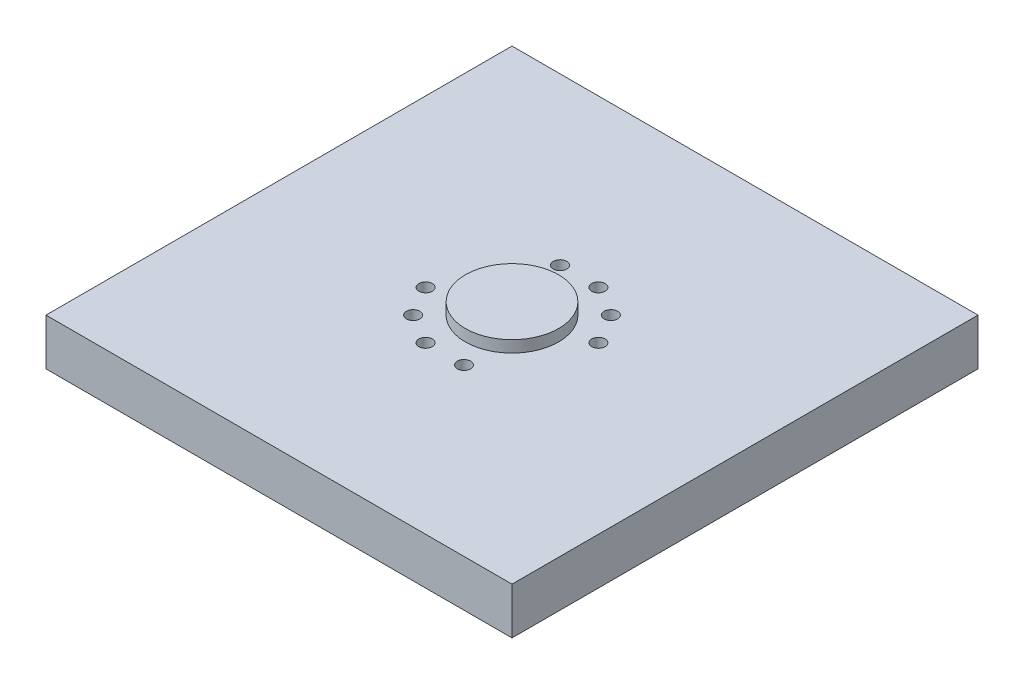
ISO-10303-21;
HEADER;
FILE_DESCRIPTION(('STEP AP214'),'2;1');
FILE_NAME('part.step','',(''),(''),'','','');
FILE_SCHEMA(('AUTOMOTIVE_DESIGN { 1 0 10303 214 1 1 1 1 }'));
ENDSEC;
DATA;
#1=APPLICATION_CONTEXT('core data for automotive mechanical design processes');
#2=APPLICATION_PROTOCOL_DEFINITION('international standard','automotive_design',2000,#1);
#3=PRODUCT_CONTEXT('',#1,'mechanical');
#4=PRODUCT('Part','Part','',(#3));
#5=PRODUCT_RELATED_PRODUCT_CATEGORY('part','',(#4));
#6=PRODUCT_DEFINITION_FORMATION('','',#4);
#7=PRODUCT_DEFINITION_CONTEXT('part definition',#1,'design');
#8=PRODUCT_DEFINITION('design','',#6,#7);
#9=PRODUCT_DEFINITION_SHAPE('','',#8);
#10=(LENGTH_UNIT() NAMED_UNIT(*) SI_UNIT(.MILLI.,.METRE.));
#11=(NAMED_UNIT(*) PLANE_ANGLE_UNIT() SI_UNIT($,.RADIAN.));
#12=(NAMED_UNIT(*) SI_UNIT($,.STERADIAN.) SOLID_ANGLE_UNIT());
#13=UNCERTAINTY_MEASURE_WITH_UNIT(LENGTH_MEASURE(1.E-05),#10,'distance_accuracy_value','');
#14=(GEOMETRIC_REPRESENTATION_CONTEXT(3) GLOBAL_UNCERTAINTY_ASSIGNED_CONTEXT((#13)) GLOBAL_UNIT_ASSIGNED_CONTEXT((#10,
#11,#12)) REPRESENTATION_CONTEXT('',''));
#15=CARTESIAN_POINT('',(0.,0.,0.));
#16=DIRECTION('',(0.,0.,1.));
#17=DIRECTION('',(1.,0.,0.));
#18=AXIS2_PLACEMENT_3D('',#15,#16,#17);
#19=CARTESIAN_POINT('',(0.,15.875,0.));
#20=DIRECTION('',(1.,0.,0.));
#21=DIRECTION('',(0.,0.,-1.));
#22=AXIS2_PLACEMENT_3D('',#19,#20,#21);
#23=PLANE('',#22);
#24=DIRECTION('',(0.,0.,1.));
#25=VECTOR('',#24,1.);
#26=CARTESIAN_POINT('',(0.,12.7,-127.));
#27=LINE('',#26,#25);
#28=CARTESIAN_POINT('',(0.,12.7,-127.));
#29=VERTEX_POINT('',#28);
#30=CARTESIAN_POINT('',(0.,12.7,0.));
#31=VERTEX_POINT('',#30);
#32=EDGE_CURVE('E73',#29,#31,#27,.T.);
#33=ORIENTED_EDGE('',*,*,#32,.F.);
#34=DIRECTION('',(0.,-1.,0.));
#35=VECTOR('',#34,1.);
#36=CARTESIAN_POINT('',(0.,15.875,-127.));
#37=LINE('',#36,#35);
#38=CARTESIAN_POINT('',(0.,0.,-127.));
#39=VERTEX_POINT('',#38);
#40=EDGE_CURVE('E55',#29,#39,#37,.T.);
#41=ORIENTED_EDGE('',*,*,#40,.T.);
#42=DIRECTION('',(0.,0.,1.));
#43=VECTOR('',#42,1.);
#44=CARTESIAN_POINT('',(0.,0.,0.));
#45=LINE('',#44,#43);
#46=CARTESIAN_POINT('',(0.,0.,0.));
#47=VERTEX_POINT('',#46);
#48=EDGE_CURVE('E103',#39,#47,#45,.T.);
#49=ORIENTED_EDGE('',*,*,#48,.T.);
#50=DIRECTION('',(0.,-1.,0.));
#51=VECTOR('',#50,1.);
#52=CARTESIAN_POINT('',(0.,15.875,0.));
#53=LINE('',#52,#51);
#54=EDGE_CURVE('E11',#31,#47,#53,.T.);
#55=ORIENTED_EDGE('',*,*,#54,.F.);
#56=EDGE_LOOP('',(#33,#41,#49,#55));
#57=FACE_BOUND('',#56,.T.);
#58=ADVANCED_FACE('F33',(#57),#23,.F.);
#59=CARTESIAN_POINT('',(0.,15.875,0.));
#60=DIRECTION('',(0.,0.,-1.));
#61=DIRECTION('',(-1.,0.,0.));
#62=AXIS2_PLACEMENT_3D('',#59,#60,#61);
#63=PLANE('',#62);
#64=DIRECTION('',(1.,0.,0.));
#65=VECTOR('',#64,1.);
#66=CARTESIAN_POINT('',(0.,12.7,0.));
#67=LINE('',#66,#65);
#68=CARTESIAN_POINT('',(127.,12.7,0.));
#69=VERTEX_POINT('',#68);
#70=EDGE_CURVE('E80',#31,#69,#67,.T.);
#71=ORIENTED_EDGE('',*,*,#70,.F.);
#72=ORIENTED_EDGE('',*,*,#54,.T.);
#73=DIRECTION('',(1.,0.,0.));
#74=VECTOR('',#73,1.);
#75=CARTESIAN_POINT('',(0.,0.,0.));
#76=LINE('',#75,#74);
#77=CARTESIAN_POINT('',(127.,0.,0.));
#78=VERTEX_POINT('',#77);
#79=EDGE_CURVE('E100',#47,#78,#76,.T.);
#80=ORIENTED_EDGE('',*,*,#79,.T.);
#81=DIRECTION('',(0.,-1.,0.));
#82=VECTOR('',#81,1.);
#83=CARTESIAN_POINT('',(127.,15.875,0.));
#84=LINE('',#83,#82);
#85=EDGE_CURVE('E40',#69,#78,#84,.T.);
#86=ORIENTED_EDGE('',*,*,#85,.F.);
#87=EDGE_LOOP('',(#71,#72,#80,#86));
#88=FACE_BOUND('',#87,.T.);
#89=ADVANCED_FACE('F101',(#88),#63,.F.);
#90=CARTESIAN_POINT('',(127.,15.875,0.));
#91=DIRECTION('',(-1.,0.,0.));
#92=DIRECTION('',(0.,0.,1.));
#93=AXIS2_PLACEMENT_3D('',#90,#91,#92);
#94=PLANE('',#93);
#95=DIRECTION('',(0.,0.,-1.));
#96=VECTOR('',#95,1.);
#97=CARTESIAN_POINT('',(127.,12.7,0.));
#98=LINE('',#97,#96);
#99=CARTESIAN_POINT('',(127.,12.7,-127.));
#100=VERTEX_POINT('',#99);
#101=EDGE_CURVE('E47',#69,#100,#98,.T.);
#102=ORIENTED_EDGE('',*,*,#101,.F.);
#103=ORIENTED_EDGE('',*,*,#85,.T.);
#104=DIRECTION('',(0.,0.,-1.));
#105=VECTOR('',#104,1.);
#106=CARTESIAN_POINT('',(127.,0.,0.));
#107=LINE('',#106,#105);
#108=CARTESIAN_POINT('',(127.,0.,-127.));
#109=VERTEX_POINT('',#108);
#110=EDGE_CURVE('E89',#78,#109,#107,.T.);
#111=ORIENTED_EDGE('',*,*,#110,.T.);
#112=DIRECTION('',(0.,-1.,0.));
#113=VECTOR('',#112,1.);
#114=CARTESIAN_POINT('',(127.,15.875,-127.));
#115=LINE('',#114,#113);
#116=EDGE_CURVE('E86',#100,#109,#115,.T.);
#117=ORIENTED_EDGE('',*,*,#116,.F.);
#118=EDGE_LOOP('',(#102,#103,#111,#117));
#119=FACE_BOUND('',#118,.T.);
#120=ADVANCED_FACE('F96',(#119),#94,.F.);
#121=CARTESIAN_POINT('',(0.,15.875,-127.));
#122=DIRECTION('',(0.,0.,1.));
#123=DIRECTION('',(1.,0.,0.));
#124=AXIS2_PLACEMENT_3D('',#121,#122,#123);
#125=PLANE('',#124);
#126=DIRECTION('',(-1.,0.,0.));
#127=VECTOR('',#126,1.);
#128=CARTESIAN_POINT('',(127.,12.7,-127.));
#129=LINE('',#128,#127);
#130=EDGE_CURVE('E71',#100,#29,#129,.T.);
#131=ORIENTED_EDGE('',*,*,#130,.F.);
#132=ORIENTED_EDGE('',*,*,#116,.T.);
#133=DIRECTION('',(-1.,0.,0.));
#134=VECTOR('',#133,1.);
#135=CARTESIAN_POINT('',(0.,0.,-127.));
#136=LINE('',#135,#134);
#137=EDGE_CURVE('E84',#109,#39,#136,.T.);
#138=ORIENTED_EDGE('',*,*,#137,.T.);
#139=ORIENTED_EDGE('',*,*,#40,.F.);
#140=EDGE_LOOP('',(#131,#132,#138,#139));
#141=FACE_BOUND('',#140,.T.);
#142=ADVANCED_FACE('F82',(#141),#125,.F.);
#143=CARTESIAN_POINT('',(0.,0.,0.));
#144=DIRECTION('',(0.,-1.,0.));
#145=DIRECTION('',(0.,0.,-1.));
#146=AXIS2_PLACEMENT_3D('',#143,#144,#145);
#147=PLANE('',#146);
#148=CARTESIAN_POINT('',(50.0296158183963,0.,-50.0296158183963));
#149=DIRECTION('',(0.,-1.,0.));
#150=DIRECTION('',(0.,0.,-1.));
#151=AXIS2_PLACEMENT_3D('',#148,#149,#150);
#152=CIRCLE('',#151,1.8288);
#153=CARTESIAN_POINT('',(50.0296158183963,0.,-51.8584158183963));
#154=VERTEX_POINT('',#153);
#155=EDGE_CURVE('E155',#154,#154,#152,.F.);
#156=ORIENTED_EDGE('',*,*,#155,.T.);
#157=EDGE_LOOP('',(#156));
#158=FACE_BOUND('',#157,.T.);
#159=CARTESIAN_POINT('',(76.9703841816037,0.,-76.9703841816037));
#160=DIRECTION('',(0.,-1.,0.));
#161=DIRECTION('',(0.,0.,-1.));
#162=AXIS2_PLACEMENT_3D('',#159,#160,#161);
#163=CIRCLE('',#162,1.8288);
#164=CARTESIAN_POINT('',(76.9703841816037,0.,-78.7991841816037));
#165=VERTEX_POINT('',#164);
#166=EDGE_CURVE('E152',#165,#165,#163,.F.);
#167=ORIENTED_EDGE('',*,*,#166,.T.);
#168=EDGE_LOOP('',(#167));
#169=FACE_BOUND('',#168,.T.);
#170=CARTESIAN_POINT('',(68.7334374864451,0.,-81.8170312025577));
#171=DIRECTION('',(0.,-1.,0.));
#172=DIRECTION('',(0.,0.,-1.));
#173=AXIS2_PLACEMENT_3D('',#170,#171,#172);
#174=CIRCLE('',#173,1.82880000000001);
#175=CARTESIAN_POINT('',(68.7334374864451,0.,-83.6458312025577));
#176=VERTEX_POINT('',#175);
#177=EDGE_CURVE('E143',#176,#176,#174,.F.);
#178=ORIENTED_EDGE('',*,*,#177,.T.);
#179=EDGE_LOOP('',(#178));
#180=FACE_BOUND('',#179,.T.);
#181=CARTESIAN_POINT('',(58.2665625135549,0.,-45.1829687974423));
#182=DIRECTION('',(0.,-1.,0.));
#183=DIRECTION('',(0.,0.,-1.));
#184=AXIS2_PLACEMENT_3D('',#181,#182,#183);
#185=CIRCLE('',#184,1.82880000000001);
#186=CARTESIAN_POINT('',(58.2665625135549,0.,-47.0117687974423));
#187=VERTEX_POINT('',#186);
#188=EDGE_CURVE('E140',#187,#187,#185,.F.);
#189=ORIENTED_EDGE('',*,*,#188,.T.);
#190=EDGE_LOOP('',(#189));
#191=FACE_BOUND('',#190,.T.);
#192=CARTESIAN_POINT('',(58.2665625135549,0.,-81.8170312025577));
#193=DIRECTION('',(0.,-1.,0.));
#194=DIRECTION('',(0.,0.,-1.));
#195=AXIS2_PLACEMENT_3D('',#192,#193,#194);
#196=CIRCLE('',#195,1.8288);
#197=CARTESIAN_POINT('',(58.2665625135549,0.,-83.6458312025577));
#198=VERTEX_POINT('',#197);
#199=EDGE_CURVE('E134',#198,#198,#196,.F.);
#200=ORIENTED_EDGE('',*,*,#199,.T.);
#201=EDGE_LOOP('',(#200));
#202=FACE_BOUND('',#201,.T.);
#203=CARTESIAN_POINT('',(81.8170312025577,0.,-68.7334374864451));
#204=DIRECTION('',(0.,-1.,0.));
#205=DIRECTION('',(0.,0.,-1.));
#206=AXIS2_PLACEMENT_3D('',#203,#204,#205);
#207=CIRCLE('',#206,1.82880000000001);
#208=CARTESIAN_POINT('',(81.8170312025577,0.,-70.5622374864451));
#209=VERTEX_POINT('',#208);
#210=EDGE_CURVE('E128',#209,#209,#207,.F.);
#211=ORIENTED_EDGE('',*,*,#210,.T.);
#212=EDGE_LOOP('',(#211));
#213=FACE_BOUND('',#212,.T.);
#214=CARTESIAN_POINT('',(68.7334374864451,0.,-45.1829687974423));
#215=DIRECTION('',(0.,-1.,0.));
#216=DIRECTION('',(0.,0.,-1.));
#217=AXIS2_PLACEMENT_3D('',#214,#215,#216);
#218=CIRCLE('',#217,1.8288);
#219=CARTESIAN_POINT('',(68.7334374864451,0.,-47.0117687974423));
#220=VERTEX_POINT('',#219);
#221=EDGE_CURVE('E122',#220,#220,#218,.F.);
#222=ORIENTED_EDGE('',*,*,#221,.T.);
#223=EDGE_LOOP('',(#222));
#224=FACE_BOUND('',#223,.T.);
#225=CARTESIAN_POINT('',(45.1829687974423,0.,-58.2665625135549));
#226=DIRECTION('',(0.,-1.,0.));
#227=DIRECTION('',(0.,0.,-1.));
#228=AXIS2_PLACEMENT_3D('',#225,#226,#227);
#229=CIRCLE('',#228,1.8288);
#230=CARTESIAN_POINT('',(45.1829687974423,0.,-60.0953625135549));
#231=VERTEX_POINT('',#230);
#232=EDGE_CURVE('E116',#231,#231,#229,.F.);
#233=ORIENTED_EDGE('',*,*,#232,.T.);
#234=EDGE_LOOP('',(#233));
#235=FACE_BOUND('',#234,.T.);
#236=ORIENTED_EDGE('',*,*,#48,.F.);
#237=ORIENTED_EDGE('',*,*,#137,.F.);
#238=ORIENTED_EDGE('',*,*,#110,.F.);
#239=ORIENTED_EDGE('',*,*,#79,.F.);
#240=EDGE_LOOP('',(#236,#237,#238,#239));
#241=FACE_BOUND('',#240,.T.);
#242=ADVANCED_FACE('F105',(#158,#169,#180,#191,#202,#213,#224,#235,#241),#147,.T.);
#243=CARTESIAN_POINT('',(0.,12.7,0.));
#244=DIRECTION('',(0.,1.,0.));
#245=DIRECTION('',(0.,0.,1.));
#246=AXIS2_PLACEMENT_3D('',#243,#244,#245);
#247=PLANE('',#246);
#248=CARTESIAN_POINT('',(50.0296158183963,12.7,-50.0296158183963));
#249=DIRECTION('',(0.,1.,0.));
#250=DIRECTION('',(0.,0.,1.));
#251=AXIS2_PLACEMENT_3D('',#248,#249,#250);
#252=CIRCLE('',#251,1.8288);
#253=CARTESIAN_POINT('',(50.0296158183963,12.7,-48.2008158183963));
#254=VERTEX_POINT('',#253);
#255=EDGE_CURVE('E158',#254,#254,#252,.T.);
#256=ORIENTED_EDGE('',*,*,#255,.F.);
#257=EDGE_LOOP('',(#256));
#258=FACE_BOUND('',#257,.T.);
#259=CARTESIAN_POINT('',(76.9703841816037,12.7,-76.9703841816037));
#260=DIRECTION('',(0.,1.,0.));
#261=DIRECTION('',(0.,0.,1.));
#262=AXIS2_PLACEMENT_3D('',#259,#260,#261);
#263=CIRCLE('',#262,1.8288);
#264=CARTESIAN_POINT('',(76.9703841816037,12.7,-75.1415841816037));
#265=VERTEX_POINT('',#264);
#266=EDGE_CURVE('E149',#265,#265,#263,.T.);
#267=ORIENTED_EDGE('',*,*,#266,.F.);
#268=EDGE_LOOP('',(#267));
#269=FACE_BOUND('',#268,.T.);
#270=CARTESIAN_POINT('',(68.7334374864451,12.7,-81.8170312025577));
#271=DIRECTION('',(0.,1.,0.));
#272=DIRECTION('',(0.,0.,1.));
#273=AXIS2_PLACEMENT_3D('',#270,#271,#272);
#274=CIRCLE('',#273,1.82880000000001);
#275=CARTESIAN_POINT('',(68.7334374864451,12.7,-79.9882312025577));
#276=VERTEX_POINT('',#275);
#277=EDGE_CURVE('E146',#276,#276,#274,.T.);
#278=ORIENTED_EDGE('',*,*,#277,.F.);
#279=EDGE_LOOP('',(#278));
#280=FACE_BOUND('',#279,.T.);
#281=CARTESIAN_POINT('',(58.2665625135549,12.7,-45.1829687974423));
#282=DIRECTION('',(0.,1.,0.));
#283=DIRECTION('',(0.,0.,1.));
#284=AXIS2_PLACEMENT_3D('',#281,#282,#283);
#285=CIRCLE('',#284,1.82880000000001);
#286=CARTESIAN_POINT('',(58.2665625135549,12.7,-43.3541687974423));
#287=VERTEX_POINT('',#286);
#288=EDGE_CURVE('E137',#287,#287,#285,.T.);
#289=ORIENTED_EDGE('',*,*,#288,.F.);
#290=EDGE_LOOP('',(#289));
#291=FACE_BOUND('',#290,.T.);
#292=CARTESIAN_POINT('',(58.2665625135549,12.7,-81.8170312025577));
#293=DIRECTION('',(0.,1.,0.));
#294=DIRECTION('',(0.,0.,1.));
#295=AXIS2_PLACEMENT_3D('',#292,#293,#294);
#296=CIRCLE('',#295,1.8288);
#297=CARTESIAN_POINT('',(58.2665625135549,12.7,-79.9882312025577));
#298=VERTEX_POINT('',#297);
#299=EDGE_CURVE('E131',#298,#298,#296,.T.);
#300=ORIENTED_EDGE('',*,*,#299,.F.);
#301=EDGE_LOOP('',(#300));
#302=FACE_BOUND('',#301,.T.);
#303=CARTESIAN_POINT('',(81.8170312025577,12.7,-68.7334374864451));
#304=DIRECTION('',(0.,1.,0.));
#305=DIRECTION('',(0.,0.,1.));
#306=AXIS2_PLACEMENT_3D('',#303,#304,#305);
#307=CIRCLE('',#306,1.82880000000001);
#308=CARTESIAN_POINT('',(81.8170312025577,12.7,-66.904637486445));
#309=VERTEX_POINT('',#308);
#310=EDGE_CURVE('E125',#309,#309,#307,.T.);
#311=ORIENTED_EDGE('',*,*,#310,.F.);
#312=EDGE_LOOP('',(#311));
#313=FACE_BOUND('',#312,.T.);
#314=CARTESIAN_POINT('',(68.7334374864451,12.7,-45.1829687974423));
#315=DIRECTION('',(0.,1.,0.));
#316=DIRECTION('',(0.,0.,1.));
#317=AXIS2_PLACEMENT_3D('',#314,#315,#316);
#318=CIRCLE('',#317,1.8288);
#319=CARTESIAN_POINT('',(68.7334374864451,12.7,-43.3541687974423));
#320=VERTEX_POINT('',#319);
#321=EDGE_CURVE('E119',#320,#320,#318,.T.);
#322=ORIENTED_EDGE('',*,*,#321,.F.);
#323=EDGE_LOOP('',(#322));
#324=FACE_BOUND('',#323,.T.);
#325=CARTESIAN_POINT('',(45.1829687974423,12.7,-58.2665625135549));
#326=DIRECTION('',(0.,1.,0.));
#327=DIRECTION('',(0.,0.,1.));
#328=AXIS2_PLACEMENT_3D('',#325,#326,#327);
#329=CIRCLE('',#328,1.8288);
#330=CARTESIAN_POINT('',(45.1829687974423,12.7,-56.4377625135549));
#331=VERTEX_POINT('',#330);
#332=EDGE_CURVE('E113',#331,#331,#329,.T.);
#333=ORIENTED_EDGE('',*,*,#332,.F.);
#334=EDGE_LOOP('',(#333));
#335=FACE_BOUND('',#334,.T.);
#336=CARTESIAN_POINT('',(63.5,12.7,-63.5));
#337=DIRECTION('',(0.,1.,0.));
#338=DIRECTION('',(0.,0.,1.));
#339=AXIS2_PLACEMENT_3D('',#336,#337,#338);
#340=CIRCLE('',#339,12.7);
#341=CARTESIAN_POINT('',(63.5,12.7,-50.8));
#342=VERTEX_POINT('',#341);
#343=EDGE_CURVE('E77',#342,#342,#340,.T.);
#344=ORIENTED_EDGE('',*,*,#343,.F.);
#345=EDGE_LOOP('',(#344));
#346=FACE_BOUND('',#345,.T.);
#347=ORIENTED_EDGE('',*,*,#130,.T.);
#348=ORIENTED_EDGE('',*,*,#32,.T.);
#349=ORIENTED_EDGE('',*,*,#70,.T.);
#350=ORIENTED_EDGE('',*,*,#101,.T.);
#351=EDGE_LOOP('',(#347,#348,#349,#350));
#352=FACE_BOUND('',#351,.T.);
#353=ADVANCED_FACE('F72',(#258,#269,#280,#291,#302,#313,#324,#335,#346,#352),#247,.T.);
#354=CARTESIAN_POINT('',(63.5,12.7,-63.5));
#355=DIRECTION('',(0.,1.,0.));
#356=DIRECTION('',(0.,0.,1.));
#357=AXIS2_PLACEMENT_3D('',#354,#355,#356);
#358=CYLINDRICAL_SURFACE('',#357,12.7);
#359=ORIENTED_EDGE('',*,*,#343,.T.);
#360=EDGE_LOOP('',(#359));
#361=FACE_BOUND('',#360,.T.);
#362=CARTESIAN_POINT('',(63.5,15.875,-63.5));
#363=DIRECTION('',(0.,1.,0.));
#364=DIRECTION('',(0.,0.,1.));
#365=AXIS2_PLACEMENT_3D('',#362,#363,#364);
#366=CIRCLE('',#365,12.7);
#367=CARTESIAN_POINT('',(63.5,15.875,-50.8));
#368=VERTEX_POINT('',#367);
#369=EDGE_CURVE('E110',#368,#368,#366,.T.);
#370=ORIENTED_EDGE('',*,*,#369,.F.);
#371=EDGE_LOOP('',(#370));
#372=FACE_BOUND('',#371,.T.);
#373=ADVANCED_FACE('F175',(#361,#372),#358,.T.);
#374=CARTESIAN_POINT('',(0.,15.875,0.));
#375=DIRECTION('',(0.,-1.,0.));
#376=DIRECTION('',(0.,0.,-1.));
#377=AXIS2_PLACEMENT_3D('',#374,#375,#376);
#378=PLANE('',#377);
#379=ORIENTED_EDGE('',*,*,#369,.T.);
#380=EDGE_LOOP('',(#379));
#381=FACE_BOUND('',#380,.T.);
#382=ADVANCED_FACE('F195',(#381),#378,.F.);
#383=CARTESIAN_POINT('',(45.1829687974423,-0.000999999999999265,-58.2665625135549));
#384=DIRECTION('',(0.,1.,0.));
#385=DIRECTION('',(0.,0.,1.));
#386=AXIS2_PLACEMENT_3D('',#383,#384,#385);
#387=CYLINDRICAL_SURFACE('',#386,1.8288);
#388=ORIENTED_EDGE('',*,*,#232,.F.);
#389=EDGE_LOOP('',(#388));
#390=FACE_BOUND('',#389,.T.);
#391=ORIENTED_EDGE('',*,*,#332,.T.);
#392=EDGE_LOOP('',(#391));
#393=FACE_BOUND('',#392,.T.);
#394=ADVANCED_FACE('F200',(#390,#393),#387,.F.);
#395=CARTESIAN_POINT('',(68.7334374864451,-0.000999999999999265,-45.1829687974423));
#396=DIRECTION('',(0.,1.,0.));
#397=DIRECTION('',(0.,0.,1.));
#398=AXIS2_PLACEMENT_3D('',#395,#396,#397);
#399=CYLINDRICAL_SURFACE('',#398,1.8288);
#400=ORIENTED_EDGE('',*,*,#221,.F.);
#401=EDGE_LOOP('',(#400));
#402=FACE_BOUND('',#401,.T.);
#403=ORIENTED_EDGE('',*,*,#321,.T.);
#404=EDGE_LOOP('',(#403));
#405=FACE_BOUND('',#404,.T.);
#406=ADVANCED_FACE('F205',(#402,#405),#399,.F.);
#407=CARTESIAN_POINT('',(81.8170312025577,-0.000999999999999265,-68.7334374864451));
#408=DIRECTION('',(0.,1.,0.));
#409=DIRECTION('',(0.,0.,1.));
#410=AXIS2_PLACEMENT_3D('',#407,#408,#409);
#411=CYLINDRICAL_SURFACE('',#410,1.82880000000001);
#412=ORIENTED_EDGE('',*,*,#210,.F.);
#413=EDGE_LOOP('',(#412));
#414=FACE_BOUND('',#413,.T.);
#415=ORIENTED_EDGE('',*,*,#310,.T.);
#416=EDGE_LOOP('',(#415));
#417=FACE_BOUND('',#416,.T.);
#418=ADVANCED_FACE('F264',(#414,#417),#411,.F.);
#419=CARTESIAN_POINT('',(58.2665625135549,-0.000999999999999265,-81.8170312025577));
#420=DIRECTION('',(0.,1.,0.));
#421=DIRECTION('',(0.,0.,1.));
#422=AXIS2_PLACEMENT_3D('',#419,#420,#421);
#423=CYLINDRICAL_SURFACE('',#422,1.8288);
#424=ORIENTED_EDGE('',*,*,#199,.F.);
#425=EDGE_LOOP('',(#424));
#426=FACE_BOUND('',#425,.T.);
#427=ORIENTED_EDGE('',*,*,#299,.T.);
#428=EDGE_LOOP('',(#427));
#429=FACE_BOUND('',#428,.T.);
#430=ADVANCED_FACE('F256',(#426,#429),#423,.F.);
#431=CARTESIAN_POINT('',(58.2665625135549,-0.000999999999999265,-45.1829687974423));
#432=DIRECTION('',(0.,1.,0.));
#433=DIRECTION('',(0.,0.,1.));
#434=AXIS2_PLACEMENT_3D('',#431,#432,#433);
#435=CYLINDRICAL_SURFACE('',#434,1.82880000000001);
#436=ORIENTED_EDGE('',*,*,#188,.F.);
#437=EDGE_LOOP('',(#436));
#438=FACE_BOUND('',#437,.T.);
#439=ORIENTED_EDGE('',*,*,#288,.T.);
#440=EDGE_LOOP('',(#439));
#441=FACE_BOUND('',#440,.T.);
#442=ADVANCED_FACE('F251',(#438,#441),#435,.F.);
#443=CARTESIAN_POINT('',(68.7334374864451,-0.000999999999999265,-81.8170312025577));
#444=DIRECTION('',(0.,1.,0.));
#445=DIRECTION('',(0.,0.,1.));
#446=AXIS2_PLACEMENT_3D('',#443,#444,#445);
#447=CYLINDRICAL_SURFACE('',#446,1.82880000000001);
#448=ORIENTED_EDGE('',*,*,#177,.F.);
#449=EDGE_LOOP('',(#448));
#450=FACE_BOUND('',#449,.T.);
#451=ORIENTED_EDGE('',*,*,#277,.T.);
#452=EDGE_LOOP('',(#451));
#453=FACE_BOUND('',#452,.T.);
#454=ADVANCED_FACE('F226',(#450,#453),#447,.F.);
#455=CARTESIAN_POINT('',(76.9703841816037,-0.000999999999999265,-76.9703841816037));
#456=DIRECTION('',(0.,1.,0.));
#457=DIRECTION('',(0.,0.,1.));
#458=AXIS2_PLACEMENT_3D('',#455,#456,#457);
#459=CYLINDRICAL_SURFACE('',#458,1.8288);
#460=ORIENTED_EDGE('',*,*,#166,.F.);
#461=EDGE_LOOP('',(#460));
#462=FACE_BOUND('',#461,.T.);
#463=ORIENTED_EDGE('',*,*,#266,.T.);
#464=EDGE_LOOP('',(#463));
#465=FACE_BOUND('',#464,.T.);
#466=ADVANCED_FACE('F169',(#462,#465),#459,.F.);
#467=CARTESIAN_POINT('',(50.0296158183963,-0.000999999999999265,-50.0296158183963));
#468=DIRECTION('',(0.,1.,0.));
#469=DIRECTION('',(0.,0.,1.));
#470=AXIS2_PLACEMENT_3D('',#467,#468,#469);
#471=CYLINDRICAL_SURFACE('',#470,1.8288);
#472=ORIENTED_EDGE('',*,*,#155,.F.);
#473=EDGE_LOOP('',(#472));
#474=FACE_BOUND('',#473,.T.);
#475=ORIENTED_EDGE('',*,*,#255,.T.);
#476=EDGE_LOOP('',(#475));
#477=FACE_BOUND('',#476,.T.);
#478=ADVANCED_FACE('F166',(#474,#477),#471,.F.);
#479=CLOSED_SHELL('',(#58,#89,#120,#142,#242,#353,#373,#382,#394,#406,#418,#430,#442,#454,#466,#478));
#480=MANIFOLD_SOLID_BREP('B2',#479);
#481=ADVANCED_BREP_SHAPE_REPRESENTATION('',(#18,#480),#14);
#482=SHAPE_DEFINITION_REPRESENTATION(#9,#481);
ENDSEC;
END-ISO-10303-21;
